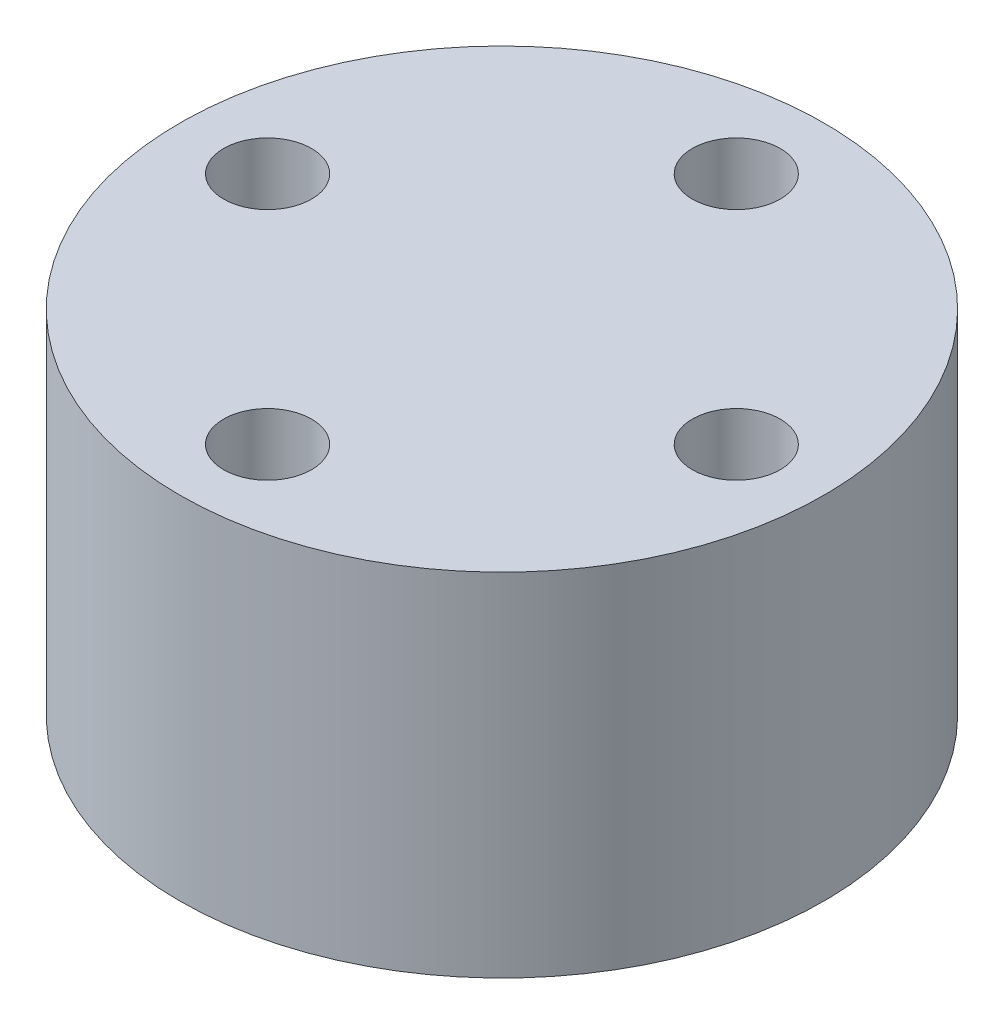
ISO-10303-21;
HEADER;
FILE_DESCRIPTION(('STEP AP214'),'2;1');
FILE_NAME('part.step','',(''),(''),'','','');
FILE_SCHEMA(('AUTOMOTIVE_DESIGN { 1 0 10303 214 1 1 1 1 }'));
ENDSEC;
DATA;
#1=APPLICATION_CONTEXT('core data for automotive mechanical design processes');
#2=APPLICATION_PROTOCOL_DEFINITION('international standard','automotive_design',2000,#1);
#3=PRODUCT_CONTEXT('',#1,'mechanical');
#4=PRODUCT('Part','Part','',(#3));
#5=PRODUCT_RELATED_PRODUCT_CATEGORY('part','',(#4));
#6=PRODUCT_DEFINITION_FORMATION('','',#4);
#7=PRODUCT_DEFINITION_CONTEXT('part definition',#1,'design');
#8=PRODUCT_DEFINITION('design','',#6,#7);
#9=PRODUCT_DEFINITION_SHAPE('','',#8);
#10=(LENGTH_UNIT() NAMED_UNIT(*) SI_UNIT(.MILLI.,.METRE.));
#11=(NAMED_UNIT(*) PLANE_ANGLE_UNIT() SI_UNIT($,.RADIAN.));
#12=(NAMED_UNIT(*) SI_UNIT($,.STERADIAN.) SOLID_ANGLE_UNIT());
#13=UNCERTAINTY_MEASURE_WITH_UNIT(LENGTH_MEASURE(1.E-05),#10,'distance_accuracy_value','');
#14=(GEOMETRIC_REPRESENTATION_CONTEXT(3) GLOBAL_UNCERTAINTY_ASSIGNED_CONTEXT((#13)) GLOBAL_UNIT_ASSIGNED_CONTEXT((#10,
#11,#12)) REPRESENTATION_CONTEXT('',''));
#15=CARTESIAN_POINT('',(0.,0.,0.));
#16=DIRECTION('',(0.,0.,1.));
#17=DIRECTION('',(1.,0.,0.));
#18=AXIS2_PLACEMENT_3D('',#15,#16,#17);
#19=CARTESIAN_POINT('',(0.,12.,0.));
#20=DIRECTION('',(0.,1.,0.));
#21=DIRECTION('',(0.,0.,1.));
#22=AXIS2_PLACEMENT_3D('',#19,#20,#21);
#23=PLANE('',#22);
#24=CARTESIAN_POINT('',(0.,12.,7.99999999999992));
#25=DIRECTION('',(0.,1.,0.));
#26=DIRECTION('',(0.,0.,1.));
#27=AXIS2_PLACEMENT_3D('',#24,#25,#26);
#28=CIRCLE('',#27,1.5);
#29=CARTESIAN_POINT('',(0.,12.,9.49999999999992));
#30=VERTEX_POINT('',#29);
#31=EDGE_CURVE('E57',#30,#30,#28,.T.);
#32=ORIENTED_EDGE('',*,*,#31,.F.);
#33=EDGE_LOOP('',(#32));
#34=FACE_BOUND('',#33,.T.);
#35=CARTESIAN_POINT('',(0.,12.,-8.));
#36=DIRECTION('',(0.,1.,0.));
#37=DIRECTION('',(0.,0.,1.));
#38=AXIS2_PLACEMENT_3D('',#35,#36,#37);
#39=CIRCLE('',#38,1.5);
#40=CARTESIAN_POINT('',(0.,12.,-6.5));
#41=VERTEX_POINT('',#40);
#42=EDGE_CURVE('E46',#41,#41,#39,.T.);
#43=ORIENTED_EDGE('',*,*,#42,.F.);
#44=EDGE_LOOP('',(#43));
#45=FACE_BOUND('',#44,.T.);
#46=CARTESIAN_POINT('',(0.,12.,0.));
#47=DIRECTION('',(0.,1.,0.));
#48=DIRECTION('',(0.,0.,1.));
#49=AXIS2_PLACEMENT_3D('',#46,#47,#48);
#50=CIRCLE('',#49,11.);
#51=CARTESIAN_POINT('',(0.,12.,11.));
#52=VERTEX_POINT('',#51);
#53=EDGE_CURVE('E10',#52,#52,#50,.T.);
#54=ORIENTED_EDGE('',*,*,#53,.T.);
#55=EDGE_LOOP('',(#54));
#56=FACE_BOUND('',#55,.T.);
#57=CARTESIAN_POINT('',(8.,12.,0.));
#58=DIRECTION('',(0.,1.,0.));
#59=DIRECTION('',(0.,0.,1.));
#60=AXIS2_PLACEMENT_3D('',#57,#58,#59);
#61=CIRCLE('',#60,1.5);
#62=CARTESIAN_POINT('',(8.,12.,1.50000000000003));
#63=VERTEX_POINT('',#62);
#64=EDGE_CURVE('E51',#63,#63,#61,.T.);
#65=ORIENTED_EDGE('',*,*,#64,.F.);
#66=EDGE_LOOP('',(#65));
#67=FACE_BOUND('',#66,.T.);
#68=CARTESIAN_POINT('',(-8.,12.,0.));
#69=DIRECTION('',(0.,1.,0.));
#70=DIRECTION('',(0.,0.,1.));
#71=AXIS2_PLACEMENT_3D('',#68,#69,#70);
#72=CIRCLE('',#71,1.50000000000008);
#73=CARTESIAN_POINT('',(-8.,12.,1.50000000000008));
#74=VERTEX_POINT('',#73);
#75=EDGE_CURVE('E63',#74,#74,#72,.T.);
#76=ORIENTED_EDGE('',*,*,#75,.F.);
#77=EDGE_LOOP('',(#76));
#78=FACE_BOUND('',#77,.T.);
#79=ADVANCED_FACE('F35',(#34,#45,#56,#67,#78),#23,.T.);
#80=CARTESIAN_POINT('',(0.,0.,0.));
#81=DIRECTION('',(0.,1.,0.));
#82=DIRECTION('',(0.,0.,1.));
#83=AXIS2_PLACEMENT_3D('',#80,#81,#82);
#84=PLANE('',#83);
#85=CARTESIAN_POINT('',(0.,0.,0.));
#86=DIRECTION('',(0.,1.,0.));
#87=DIRECTION('',(0.,0.,1.));
#88=AXIS2_PLACEMENT_3D('',#85,#86,#87);
#89=CIRCLE('',#88,11.);
#90=CARTESIAN_POINT('',(0.,0.,11.));
#91=VERTEX_POINT('',#90);
#92=EDGE_CURVE('E39',#91,#91,#89,.T.);
#93=ORIENTED_EDGE('',*,*,#92,.F.);
#94=EDGE_LOOP('',(#93));
#95=FACE_BOUND('',#94,.T.);
#96=CARTESIAN_POINT('',(0.,0.,-8.));
#97=DIRECTION('',(0.,1.,0.));
#98=DIRECTION('',(0.,0.,1.));
#99=AXIS2_PLACEMENT_3D('',#96,#97,#98);
#100=CIRCLE('',#99,1.5);
#101=CARTESIAN_POINT('',(0.,0.,-6.5));
#102=VERTEX_POINT('',#101);
#103=EDGE_CURVE('E48',#102,#102,#100,.T.);
#104=ORIENTED_EDGE('',*,*,#103,.T.);
#105=EDGE_LOOP('',(#104));
#106=FACE_BOUND('',#105,.T.);
#107=CARTESIAN_POINT('',(8.,0.,0.));
#108=DIRECTION('',(0.,1.,0.));
#109=DIRECTION('',(0.,0.,1.));
#110=AXIS2_PLACEMENT_3D('',#107,#108,#109);
#111=CIRCLE('',#110,1.5);
#112=CARTESIAN_POINT('',(8.,0.,1.50000000000003));
#113=VERTEX_POINT('',#112);
#114=EDGE_CURVE('E54',#113,#113,#111,.T.);
#115=ORIENTED_EDGE('',*,*,#114,.T.);
#116=EDGE_LOOP('',(#115));
#117=FACE_BOUND('',#116,.T.);
#118=CARTESIAN_POINT('',(0.,0.,7.99999999999992));
#119=DIRECTION('',(0.,1.,0.));
#120=DIRECTION('',(0.,0.,1.));
#121=AXIS2_PLACEMENT_3D('',#118,#119,#120);
#122=CIRCLE('',#121,1.5);
#123=CARTESIAN_POINT('',(0.,0.,9.49999999999992));
#124=VERTEX_POINT('',#123);
#125=EDGE_CURVE('E60',#124,#124,#122,.T.);
#126=ORIENTED_EDGE('',*,*,#125,.T.);
#127=EDGE_LOOP('',(#126));
#128=FACE_BOUND('',#127,.T.);
#129=CARTESIAN_POINT('',(-8.,0.,0.));
#130=DIRECTION('',(0.,1.,0.));
#131=DIRECTION('',(0.,0.,1.));
#132=AXIS2_PLACEMENT_3D('',#129,#130,#131);
#133=CIRCLE('',#132,1.50000000000008);
#134=CARTESIAN_POINT('',(-8.,0.,1.50000000000008));
#135=VERTEX_POINT('',#134);
#136=EDGE_CURVE('E66',#135,#135,#133,.T.);
#137=ORIENTED_EDGE('',*,*,#136,.T.);
#138=EDGE_LOOP('',(#137));
#139=FACE_BOUND('',#138,.T.);
#140=ADVANCED_FACE('F76',(#95,#106,#117,#128,#139),#84,.F.);
#141=CARTESIAN_POINT('',(0.,12.,0.));
#142=DIRECTION('',(0.,-1.,0.));
#143=DIRECTION('',(0.,0.,-1.));
#144=AXIS2_PLACEMENT_3D('',#141,#142,#143);
#145=CYLINDRICAL_SURFACE('',#144,11.);
#146=ORIENTED_EDGE('',*,*,#53,.F.);
#147=EDGE_LOOP('',(#146));
#148=FACE_BOUND('',#147,.T.);
#149=ORIENTED_EDGE('',*,*,#92,.T.);
#150=EDGE_LOOP('',(#149));
#151=FACE_BOUND('',#150,.T.);
#152=ADVANCED_FACE('F37',(#148,#151),#145,.T.);
#153=CARTESIAN_POINT('',(0.,12.,-8.));
#154=DIRECTION('',(0.,-1.,0.));
#155=DIRECTION('',(0.,0.,-1.));
#156=AXIS2_PLACEMENT_3D('',#153,#154,#155);
#157=CYLINDRICAL_SURFACE('',#156,1.5);
#158=ORIENTED_EDGE('',*,*,#42,.T.);
#159=EDGE_LOOP('',(#158));
#160=FACE_BOUND('',#159,.T.);
#161=ORIENTED_EDGE('',*,*,#103,.F.);
#162=EDGE_LOOP('',(#161));
#163=FACE_BOUND('',#162,.T.);
#164=ADVANCED_FACE('F86',(#160,#163),#157,.F.);
#165=CARTESIAN_POINT('',(8.,12.,0.));
#166=DIRECTION('',(0.,-1.,0.));
#167=DIRECTION('',(0.,0.,-1.));
#168=AXIS2_PLACEMENT_3D('',#165,#166,#167);
#169=CYLINDRICAL_SURFACE('',#168,1.5);
#170=ORIENTED_EDGE('',*,*,#64,.T.);
#171=EDGE_LOOP('',(#170));
#172=FACE_BOUND('',#171,.T.);
#173=ORIENTED_EDGE('',*,*,#114,.F.);
#174=EDGE_LOOP('',(#173));
#175=FACE_BOUND('',#174,.T.);
#176=ADVANCED_FACE('F89',(#172,#175),#169,.F.);
#177=CARTESIAN_POINT('',(0.,12.,7.99999999999992));
#178=DIRECTION('',(0.,-1.,0.));
#179=DIRECTION('',(0.,0.,-1.));
#180=AXIS2_PLACEMENT_3D('',#177,#178,#179);
#181=CYLINDRICAL_SURFACE('',#180,1.5);
#182=ORIENTED_EDGE('',*,*,#31,.T.);
#183=EDGE_LOOP('',(#182));
#184=FACE_BOUND('',#183,.T.);
#185=ORIENTED_EDGE('',*,*,#125,.F.);
#186=EDGE_LOOP('',(#185));
#187=FACE_BOUND('',#186,.T.);
#188=ADVANCED_FACE('F93',(#184,#187),#181,.F.);
#189=CARTESIAN_POINT('',(-8.,12.,0.));
#190=DIRECTION('',(0.,-1.,0.));
#191=DIRECTION('',(0.,0.,-1.));
#192=AXIS2_PLACEMENT_3D('',#189,#190,#191);
#193=CYLINDRICAL_SURFACE('',#192,1.50000000000008);
#194=ORIENTED_EDGE('',*,*,#75,.T.);
#195=EDGE_LOOP('',(#194));
#196=FACE_BOUND('',#195,.T.);
#197=ORIENTED_EDGE('',*,*,#136,.F.);
#198=EDGE_LOOP('',(#197));
#199=FACE_BOUND('',#198,.T.);
#200=ADVANCED_FACE('F72',(#196,#199),#193,.F.);
#201=CLOSED_SHELL('',(#79,#140,#152,#164,#176,#188,#200));
#202=MANIFOLD_SOLID_BREP('B2',#201);
#203=ADVANCED_BREP_SHAPE_REPRESENTATION('',(#18,#202),#14);
#204=SHAPE_DEFINITION_REPRESENTATION(#9,#203);
ENDSEC;
END-ISO-10303-21;
